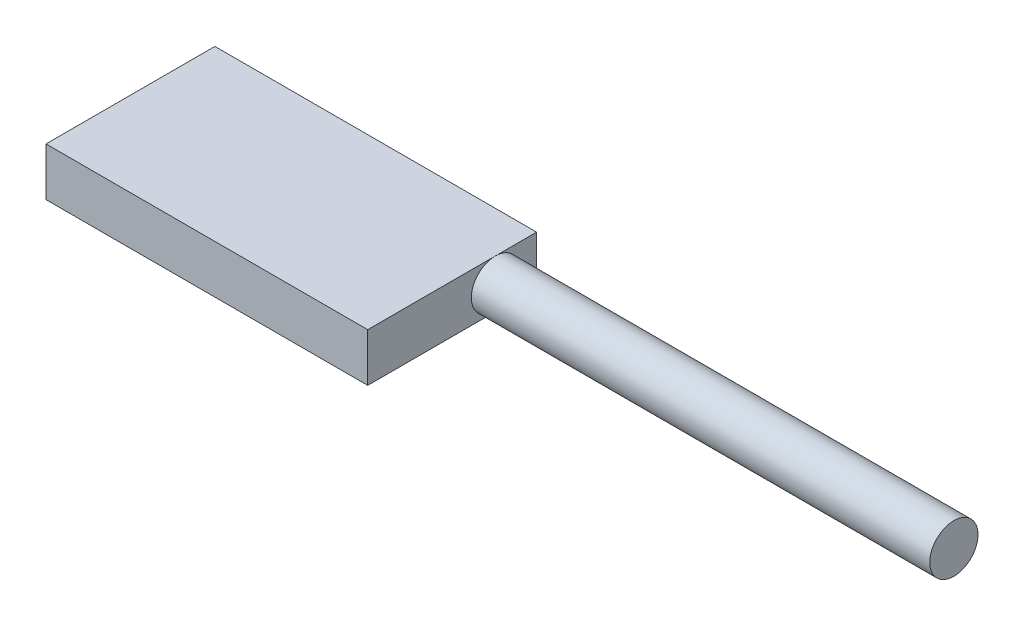
ISO-10303-21;
HEADER;
FILE_DESCRIPTION(('STEP AP214'),'2;1');
FILE_NAME('part.step','',(''),(''),'','','');
FILE_SCHEMA(('AUTOMOTIVE_DESIGN { 1 0 10303 214 1 1 1 1 }'));
ENDSEC;
DATA;
#1=APPLICATION_CONTEXT('core data for automotive mechanical design processes');
#2=APPLICATION_PROTOCOL_DEFINITION('international standard','automotive_design',2000,#1);
#3=PRODUCT_CONTEXT('',#1,'mechanical');
#4=PRODUCT('Part','Part','',(#3));
#5=PRODUCT_RELATED_PRODUCT_CATEGORY('part','',(#4));
#6=PRODUCT_DEFINITION_FORMATION('','',#4);
#7=PRODUCT_DEFINITION_CONTEXT('part definition',#1,'design');
#8=PRODUCT_DEFINITION('design','',#6,#7);
#9=PRODUCT_DEFINITION_SHAPE('','',#8);
#10=(LENGTH_UNIT() NAMED_UNIT(*) SI_UNIT(.MILLI.,.METRE.));
#11=(NAMED_UNIT(*) PLANE_ANGLE_UNIT() SI_UNIT($,.RADIAN.));
#12=(NAMED_UNIT(*) SI_UNIT($,.STERADIAN.) SOLID_ANGLE_UNIT());
#13=UNCERTAINTY_MEASURE_WITH_UNIT(LENGTH_MEASURE(1.E-05),#10,'distance_accuracy_value','');
#14=(GEOMETRIC_REPRESENTATION_CONTEXT(3) GLOBAL_UNCERTAINTY_ASSIGNED_CONTEXT((#13)) GLOBAL_UNIT_ASSIGNED_CONTEXT((#10,
#11,#12)) REPRESENTATION_CONTEXT('',''));
#15=CARTESIAN_POINT('',(0.,0.,0.));
#16=DIRECTION('',(0.,0.,1.));
#17=DIRECTION('',(1.,0.,0.));
#18=AXIS2_PLACEMENT_3D('',#15,#16,#17);
#19=CARTESIAN_POINT('',(20.,6.,-10.5));
#20=DIRECTION('',(-1.,0.,0.));
#21=DIRECTION('',(0.,0.,1.));
#22=AXIS2_PLACEMENT_3D('',#19,#20,#21);
#23=PLANE('',#22);
#24=CARTESIAN_POINT('',(20.,3.,-5.3798892094461));
#25=DIRECTION('',(1.,0.,0.));
#26=DIRECTION('',(0.,0.,-1.));
#27=AXIS2_PLACEMENT_3D('',#24,#25,#26);
#28=CIRCLE('',#27,3.);
#29=CARTESIAN_POINT('',(20.,6.,-5.3798892094461));
#30=VERTEX_POINT('',#29);
#31=CARTESIAN_POINT('',(20.,0.,-5.3798892094461));
#32=VERTEX_POINT('',#31);
#33=EDGE_CURVE('E43',#30,#32,#28,.T.);
#34=ORIENTED_EDGE('',*,*,#33,.F.);
#35=DIRECTION('',(0.,0.,-1.));
#36=VECTOR('',#35,1.);
#37=CARTESIAN_POINT('',(20.,6.,-10.5));
#38=LINE('',#37,#36);
#39=CARTESIAN_POINT('',(20.,6.,10.5));
#40=VERTEX_POINT('',#39);
#41=EDGE_CURVE('E86',#40,#30,#38,.T.);
#42=ORIENTED_EDGE('',*,*,#41,.F.);
#43=DIRECTION('',(0.,-1.,0.));
#44=VECTOR('',#43,1.);
#45=CARTESIAN_POINT('',(20.,6.,10.5));
#46=LINE('',#45,#44);
#47=CARTESIAN_POINT('',(20.,0.,10.5));
#48=VERTEX_POINT('',#47);
#49=EDGE_CURVE('E197',#40,#48,#46,.T.);
#50=ORIENTED_EDGE('',*,*,#49,.T.);
#51=DIRECTION('',(0.,0.,-1.));
#52=VECTOR('',#51,1.);
#53=CARTESIAN_POINT('',(20.,0.,-10.5));
#54=LINE('',#53,#52);
#55=EDGE_CURVE('E97',#48,#32,#54,.T.);
#56=ORIENTED_EDGE('',*,*,#55,.T.);
#57=EDGE_LOOP('',(#34,#42,#50,#56));
#58=FACE_BOUND('',#57,.T.);
#59=ADVANCED_FACE('F33',(#58),#23,.F.);
#60=EDGE_CURVE('E11',#32,#30,#28,.T.);
#61=ORIENTED_EDGE('',*,*,#60,.F.);
#62=CARTESIAN_POINT('',(20.,0.,-10.5));
#63=VERTEX_POINT('',#62);
#64=EDGE_CURVE('E202',#32,#63,#54,.T.);
#65=ORIENTED_EDGE('',*,*,#64,.T.);
#66=DIRECTION('',(0.,-1.,0.));
#67=VECTOR('',#66,1.);
#68=CARTESIAN_POINT('',(20.,6.,-10.5));
#69=LINE('',#68,#67);
#70=CARTESIAN_POINT('',(20.,6.,-10.5));
#71=VERTEX_POINT('',#70);
#72=EDGE_CURVE('E37',#71,#63,#69,.T.);
#73=ORIENTED_EDGE('',*,*,#72,.F.);
#74=EDGE_CURVE('E82',#30,#71,#38,.T.);
#75=ORIENTED_EDGE('',*,*,#74,.F.);
#76=EDGE_LOOP('',(#61,#65,#73,#75));
#77=FACE_BOUND('',#76,.T.);
#78=ADVANCED_FACE('F35',(#77),#23,.F.);
#79=CARTESIAN_POINT('',(-20.,6.,-10.5));
#80=DIRECTION('',(0.,0.,1.));
#81=DIRECTION('',(1.,0.,0.));
#82=AXIS2_PLACEMENT_3D('',#79,#80,#81);
#83=PLANE('',#82);
#84=DIRECTION('',(-1.,0.,0.));
#85=VECTOR('',#84,1.);
#86=CARTESIAN_POINT('',(-20.,0.,-10.5));
#87=LINE('',#86,#85);
#88=CARTESIAN_POINT('',(-20.,0.,-10.5));
#89=VERTEX_POINT('',#88);
#90=EDGE_CURVE('E183',#63,#89,#87,.T.);
#91=ORIENTED_EDGE('',*,*,#90,.T.);
#92=DIRECTION('',(0.,-1.,0.));
#93=VECTOR('',#92,1.);
#94=CARTESIAN_POINT('',(-20.,6.,-10.5));
#95=LINE('',#94,#93);
#96=CARTESIAN_POINT('',(-20.,6.,-10.5));
#97=VERTEX_POINT('',#96);
#98=EDGE_CURVE('E185',#97,#89,#95,.T.);
#99=ORIENTED_EDGE('',*,*,#98,.F.);
#100=DIRECTION('',(-1.,0.,0.));
#101=VECTOR('',#100,1.);
#102=CARTESIAN_POINT('',(-20.,6.,-10.5));
#103=LINE('',#102,#101);
#104=EDGE_CURVE('E90',#71,#97,#103,.T.);
#105=ORIENTED_EDGE('',*,*,#104,.F.);
#106=ORIENTED_EDGE('',*,*,#72,.T.);
#107=EDGE_LOOP('',(#91,#99,#105,#106));
#108=FACE_BOUND('',#107,.T.);
#109=ADVANCED_FACE('F120',(#108),#83,.F.);
#110=CARTESIAN_POINT('',(-20.,6.,-10.5));
#111=DIRECTION('',(1.,0.,0.));
#112=DIRECTION('',(0.,0.,-1.));
#113=AXIS2_PLACEMENT_3D('',#110,#111,#112);
#114=PLANE('',#113);
#115=DIRECTION('',(0.,0.,1.));
#116=VECTOR('',#115,1.);
#117=CARTESIAN_POINT('',(-20.,0.,-10.5));
#118=LINE('',#117,#116);
#119=CARTESIAN_POINT('',(-20.,0.,10.5));
#120=VERTEX_POINT('',#119);
#121=EDGE_CURVE('E188',#89,#120,#118,.T.);
#122=ORIENTED_EDGE('',*,*,#121,.T.);
#123=DIRECTION('',(0.,-1.,0.));
#124=VECTOR('',#123,1.);
#125=CARTESIAN_POINT('',(-20.,6.,10.5));
#126=LINE('',#125,#124);
#127=CARTESIAN_POINT('',(-20.,6.,10.5));
#128=VERTEX_POINT('',#127);
#129=EDGE_CURVE('E192',#128,#120,#126,.T.);
#130=ORIENTED_EDGE('',*,*,#129,.F.);
#131=DIRECTION('',(0.,0.,1.));
#132=VECTOR('',#131,1.);
#133=CARTESIAN_POINT('',(-20.,6.,-10.5));
#134=LINE('',#133,#132);
#135=EDGE_CURVE('E191',#97,#128,#134,.T.);
#136=ORIENTED_EDGE('',*,*,#135,.F.);
#137=ORIENTED_EDGE('',*,*,#98,.T.);
#138=EDGE_LOOP('',(#122,#130,#136,#137));
#139=FACE_BOUND('',#138,.T.);
#140=ADVANCED_FACE('F124',(#139),#114,.F.);
#141=CARTESIAN_POINT('',(-20.,6.,10.5));
#142=DIRECTION('',(0.,0.,-1.));
#143=DIRECTION('',(-1.,0.,0.));
#144=AXIS2_PLACEMENT_3D('',#141,#142,#143);
#145=PLANE('',#144);
#146=DIRECTION('',(1.,0.,0.));
#147=VECTOR('',#146,1.);
#148=CARTESIAN_POINT('',(-20.,0.,10.5));
#149=LINE('',#148,#147);
#150=EDGE_CURVE('E77',#120,#48,#149,.T.);
#151=ORIENTED_EDGE('',*,*,#150,.T.);
#152=ORIENTED_EDGE('',*,*,#49,.F.);
#153=DIRECTION('',(1.,0.,0.));
#154=VECTOR('',#153,1.);
#155=CARTESIAN_POINT('',(-20.,6.,10.5));
#156=LINE('',#155,#154);
#157=EDGE_CURVE('E57',#128,#40,#156,.T.);
#158=ORIENTED_EDGE('',*,*,#157,.F.);
#159=ORIENTED_EDGE('',*,*,#129,.T.);
#160=EDGE_LOOP('',(#151,#152,#158,#159));
#161=FACE_BOUND('',#160,.T.);
#162=ADVANCED_FACE('F129',(#161),#145,.F.);
#163=CARTESIAN_POINT('',(0.,6.,0.));
#164=DIRECTION('',(0.,1.,0.));
#165=DIRECTION('',(0.,0.,1.));
#166=AXIS2_PLACEMENT_3D('',#163,#164,#165);
#167=PLANE('',#166);
#168=ORIENTED_EDGE('',*,*,#41,.T.);
#169=ORIENTED_EDGE('',*,*,#74,.T.);
#170=ORIENTED_EDGE('',*,*,#104,.T.);
#171=ORIENTED_EDGE('',*,*,#135,.T.);
#172=ORIENTED_EDGE('',*,*,#157,.T.);
#173=EDGE_LOOP('',(#168,#169,#170,#171,#172));
#174=FACE_BOUND('',#173,.T.);
#175=ADVANCED_FACE('F87',(#174),#167,.T.);
#176=CARTESIAN_POINT('',(0.,0.,0.));
#177=DIRECTION('',(0.,1.,0.));
#178=DIRECTION('',(0.,0.,1.));
#179=AXIS2_PLACEMENT_3D('',#176,#177,#178);
#180=PLANE('',#179);
#181=ORIENTED_EDGE('',*,*,#55,.F.);
#182=ORIENTED_EDGE('',*,*,#150,.F.);
#183=ORIENTED_EDGE('',*,*,#121,.F.);
#184=ORIENTED_EDGE('',*,*,#90,.F.);
#185=ORIENTED_EDGE('',*,*,#64,.F.);
#186=EDGE_LOOP('',(#181,#182,#183,#184,#185));
#187=FACE_BOUND('',#186,.T.);
#188=ADVANCED_FACE('F103',(#187),#180,.F.);
#189=CARTESIAN_POINT('',(77.,3.,-5.3798892094461));
#190=DIRECTION('',(-1.,0.,0.));
#191=DIRECTION('',(0.,0.,1.));
#192=AXIS2_PLACEMENT_3D('',#189,#190,#191);
#193=CYLINDRICAL_SURFACE('',#192,3.);
#194=CARTESIAN_POINT('',(77.,3.,-5.3798892094461));
#195=DIRECTION('',(1.,0.,0.));
#196=DIRECTION('',(0.,0.,-1.));
#197=AXIS2_PLACEMENT_3D('',#194,#195,#196);
#198=CIRCLE('',#197,3.);
#199=CARTESIAN_POINT('',(77.,3.,-8.3798892094461));
#200=VERTEX_POINT('',#199);
#201=EDGE_CURVE('E99',#200,#200,#198,.T.);
#202=ORIENTED_EDGE('',*,*,#201,.F.);
#203=EDGE_LOOP('',(#202));
#204=FACE_BOUND('',#203,.T.);
#205=ORIENTED_EDGE('',*,*,#33,.T.);
#206=ORIENTED_EDGE('',*,*,#60,.T.);
#207=EDGE_LOOP('',(#205,#206));
#208=FACE_BOUND('',#207,.T.);
#209=ADVANCED_FACE('F100',(#204,#208),#193,.T.);
#210=CARTESIAN_POINT('',(77.,3.,-5.3798892094461));
#211=DIRECTION('',(1.,0.,0.));
#212=DIRECTION('',(0.,0.,-1.));
#213=AXIS2_PLACEMENT_3D('',#210,#211,#212);
#214=PLANE('',#213);
#215=ORIENTED_EDGE('',*,*,#201,.T.);
#216=EDGE_LOOP('',(#215));
#217=FACE_BOUND('',#216,.T.);
#218=ADVANCED_FACE('F102',(#217),#214,.T.);
#219=CLOSED_SHELL('',(#59,#78,#109,#140,#162,#175,#188,#209,#218));
#220=MANIFOLD_SOLID_BREP('B2',#219);
#221=ADVANCED_BREP_SHAPE_REPRESENTATION('',(#18,#220),#14);
#222=SHAPE_DEFINITION_REPRESENTATION(#9,#221);
ENDSEC;
END-ISO-10303-21;
